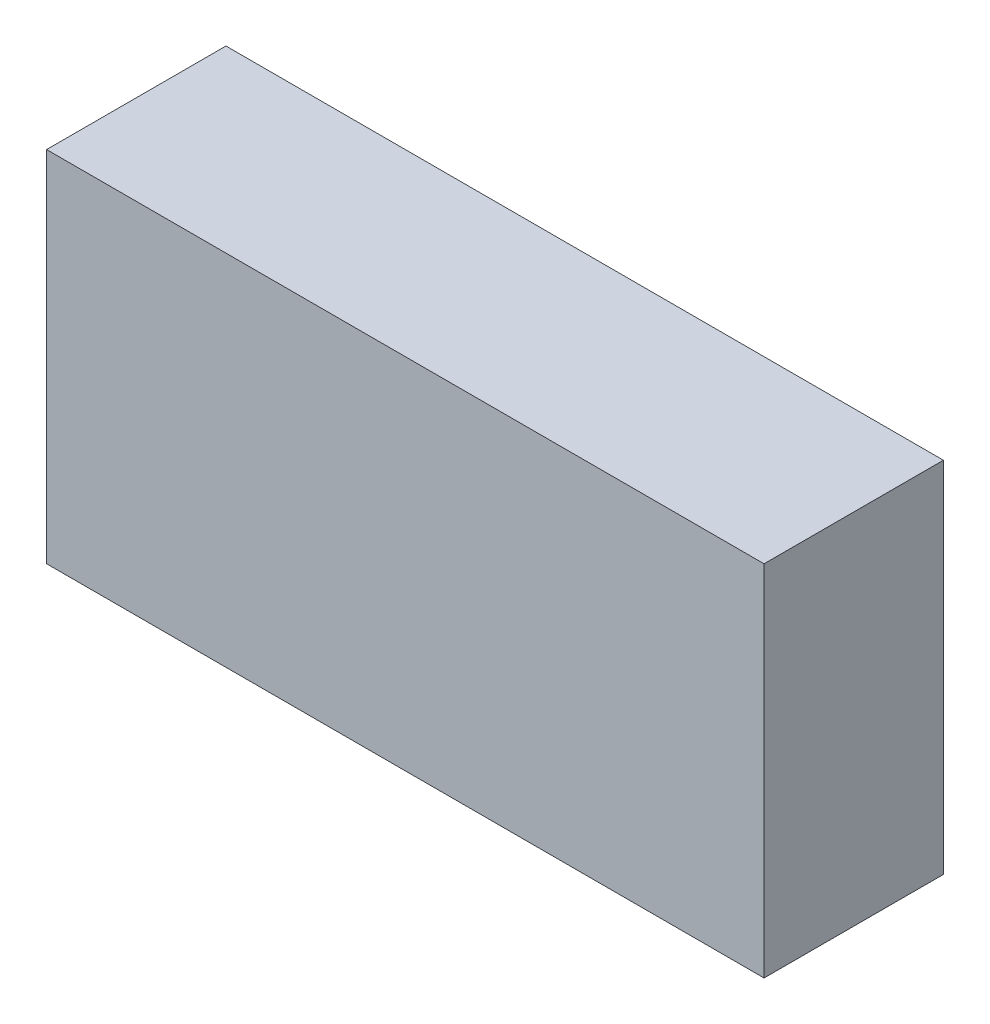
ISO-10303-21;
HEADER;
FILE_DESCRIPTION(('STEP AP214'),'2;1');
FILE_NAME('part.step','',(''),(''),'','','');
FILE_SCHEMA(('AUTOMOTIVE_DESIGN { 1 0 10303 214 1 1 1 1 }'));
ENDSEC;
DATA;
#1=APPLICATION_CONTEXT('core data for automotive mechanical design processes');
#2=APPLICATION_PROTOCOL_DEFINITION('international standard','automotive_design',2000,#1);
#3=PRODUCT_CONTEXT('',#1,'mechanical');
#4=PRODUCT('Part','Part','',(#3));
#5=PRODUCT_RELATED_PRODUCT_CATEGORY('part','',(#4));
#6=PRODUCT_DEFINITION_FORMATION('','',#4);
#7=PRODUCT_DEFINITION_CONTEXT('part definition',#1,'design');
#8=PRODUCT_DEFINITION('design','',#6,#7);
#9=PRODUCT_DEFINITION_SHAPE('','',#8);
#10=(LENGTH_UNIT() NAMED_UNIT(*) SI_UNIT(.MILLI.,.METRE.));
#11=(NAMED_UNIT(*) PLANE_ANGLE_UNIT() SI_UNIT($,.RADIAN.));
#12=(NAMED_UNIT(*) SI_UNIT($,.STERADIAN.) SOLID_ANGLE_UNIT());
#13=UNCERTAINTY_MEASURE_WITH_UNIT(LENGTH_MEASURE(1.E-05),#10,'distance_accuracy_value','');
#14=(GEOMETRIC_REPRESENTATION_CONTEXT(3) GLOBAL_UNCERTAINTY_ASSIGNED_CONTEXT((#13)) GLOBAL_UNIT_ASSIGNED_CONTEXT((#10,
#11,#12)) REPRESENTATION_CONTEXT('',''));
#15=CARTESIAN_POINT('',(0.,0.,0.));
#16=DIRECTION('',(0.,0.,1.));
#17=DIRECTION('',(1.,0.,0.));
#18=AXIS2_PLACEMENT_3D('',#15,#16,#17);
#19=CARTESIAN_POINT('',(0.,0.,35.));
#20=DIRECTION('',(1.,0.,0.));
#21=DIRECTION('',(0.,0.,-1.));
#22=AXIS2_PLACEMENT_3D('',#19,#20,#21);
#23=PLANE('',#22);
#24=DIRECTION('',(0.,-1.,0.));
#25=VECTOR('',#24,1.);
#26=CARTESIAN_POINT('',(0.,0.,0.));
#27=LINE('',#26,#25);
#28=CARTESIAN_POINT('',(0.,70.,0.));
#29=VERTEX_POINT('',#28);
#30=CARTESIAN_POINT('',(0.,0.,0.));
#31=VERTEX_POINT('',#30);
#32=EDGE_CURVE('E95',#29,#31,#27,.T.);
#33=ORIENTED_EDGE('',*,*,#32,.T.);
#34=DIRECTION('',(0.,0.,-1.));
#35=VECTOR('',#34,1.);
#36=CARTESIAN_POINT('',(0.,0.,35.));
#37=LINE('',#36,#35);
#38=CARTESIAN_POINT('',(0.,0.,35.));
#39=VERTEX_POINT('',#38);
#40=EDGE_CURVE('E11',#39,#31,#37,.T.);
#41=ORIENTED_EDGE('',*,*,#40,.F.);
#42=DIRECTION('',(0.,-1.,0.));
#43=VECTOR('',#42,1.);
#44=CARTESIAN_POINT('',(0.,0.,35.));
#45=LINE('',#44,#43);
#46=CARTESIAN_POINT('',(0.,70.,35.));
#47=VERTEX_POINT('',#46);
#48=EDGE_CURVE('E83',#47,#39,#45,.T.);
#49=ORIENTED_EDGE('',*,*,#48,.F.);
#50=DIRECTION('',(0.,0.,-1.));
#51=VECTOR('',#50,1.);
#52=CARTESIAN_POINT('',(0.,70.,35.));
#53=LINE('',#52,#51);
#54=EDGE_CURVE('E91',#47,#29,#53,.T.);
#55=ORIENTED_EDGE('',*,*,#54,.T.);
#56=EDGE_LOOP('',(#33,#41,#49,#55));
#57=FACE_BOUND('',#56,.T.);
#58=ADVANCED_FACE('F32',(#57),#23,.F.);
#59=CARTESIAN_POINT('',(0.,0.,35.));
#60=DIRECTION('',(0.,1.,0.));
#61=DIRECTION('',(0.,0.,1.));
#62=AXIS2_PLACEMENT_3D('',#59,#60,#61);
#63=PLANE('',#62);
#64=DIRECTION('',(1.,0.,0.));
#65=VECTOR('',#64,1.);
#66=CARTESIAN_POINT('',(0.,0.,0.));
#67=LINE('',#66,#65);
#68=CARTESIAN_POINT('',(140.,0.,0.));
#69=VERTEX_POINT('',#68);
#70=EDGE_CURVE('E87',#31,#69,#67,.T.);
#71=ORIENTED_EDGE('',*,*,#70,.T.);
#72=DIRECTION('',(0.,0.,-1.));
#73=VECTOR('',#72,1.);
#74=CARTESIAN_POINT('',(140.,0.,35.));
#75=LINE('',#74,#73);
#76=CARTESIAN_POINT('',(140.,0.,35.));
#77=VERTEX_POINT('',#76);
#78=EDGE_CURVE('E40',#77,#69,#75,.T.);
#79=ORIENTED_EDGE('',*,*,#78,.F.);
#80=DIRECTION('',(1.,0.,0.));
#81=VECTOR('',#80,1.);
#82=CARTESIAN_POINT('',(0.,0.,35.));
#83=LINE('',#82,#81);
#84=EDGE_CURVE('E78',#39,#77,#83,.T.);
#85=ORIENTED_EDGE('',*,*,#84,.F.);
#86=ORIENTED_EDGE('',*,*,#40,.T.);
#87=EDGE_LOOP('',(#71,#79,#85,#86));
#88=FACE_BOUND('',#87,.T.);
#89=ADVANCED_FACE('F86',(#88),#63,.F.);
#90=CARTESIAN_POINT('',(140.,0.,35.));
#91=DIRECTION('',(-1.,0.,0.));
#92=DIRECTION('',(0.,0.,1.));
#93=AXIS2_PLACEMENT_3D('',#90,#91,#92);
#94=PLANE('',#93);
#95=DIRECTION('',(0.,1.,0.));
#96=VECTOR('',#95,1.);
#97=CARTESIAN_POINT('',(140.,0.,0.));
#98=LINE('',#97,#96);
#99=CARTESIAN_POINT('',(140.,70.,0.));
#100=VERTEX_POINT('',#99);
#101=EDGE_CURVE('E65',#69,#100,#98,.T.);
#102=ORIENTED_EDGE('',*,*,#101,.T.);
#103=DIRECTION('',(0.,0.,-1.));
#104=VECTOR('',#103,1.);
#105=CARTESIAN_POINT('',(140.,70.,35.));
#106=LINE('',#105,#104);
#107=CARTESIAN_POINT('',(140.,70.,35.));
#108=VERTEX_POINT('',#107);
#109=EDGE_CURVE('E88',#108,#100,#106,.T.);
#110=ORIENTED_EDGE('',*,*,#109,.F.);
#111=DIRECTION('',(0.,1.,0.));
#112=VECTOR('',#111,1.);
#113=CARTESIAN_POINT('',(140.,0.,35.));
#114=LINE('',#113,#112);
#115=EDGE_CURVE('E81',#77,#108,#114,.T.);
#116=ORIENTED_EDGE('',*,*,#115,.F.);
#117=ORIENTED_EDGE('',*,*,#78,.T.);
#118=EDGE_LOOP('',(#102,#110,#116,#117));
#119=FACE_BOUND('',#118,.T.);
#120=ADVANCED_FACE('F89',(#119),#94,.F.);
#121=CARTESIAN_POINT('',(0.,70.,35.));
#122=DIRECTION('',(0.,-1.,0.));
#123=DIRECTION('',(0.,0.,-1.));
#124=AXIS2_PLACEMENT_3D('',#121,#122,#123);
#125=PLANE('',#124);
#126=DIRECTION('',(-1.,0.,0.));
#127=VECTOR('',#126,1.);
#128=CARTESIAN_POINT('',(0.,70.,0.));
#129=LINE('',#128,#127);
#130=EDGE_CURVE('E71',#100,#29,#129,.T.);
#131=ORIENTED_EDGE('',*,*,#130,.T.);
#132=ORIENTED_EDGE('',*,*,#54,.F.);
#133=DIRECTION('',(-1.,0.,0.));
#134=VECTOR('',#133,1.);
#135=CARTESIAN_POINT('',(0.,70.,35.));
#136=LINE('',#135,#134);
#137=EDGE_CURVE('E48',#108,#47,#136,.T.);
#138=ORIENTED_EDGE('',*,*,#137,.F.);
#139=ORIENTED_EDGE('',*,*,#109,.T.);
#140=EDGE_LOOP('',(#131,#132,#138,#139));
#141=FACE_BOUND('',#140,.T.);
#142=ADVANCED_FACE('F102',(#141),#125,.F.);
#143=CARTESIAN_POINT('',(0.,0.,35.));
#144=DIRECTION('',(0.,0.,-1.));
#145=DIRECTION('',(-1.,0.,0.));
#146=AXIS2_PLACEMENT_3D('',#143,#144,#145);
#147=PLANE('',#146);
#148=ORIENTED_EDGE('',*,*,#48,.T.);
#149=ORIENTED_EDGE('',*,*,#84,.T.);
#150=ORIENTED_EDGE('',*,*,#115,.T.);
#151=ORIENTED_EDGE('',*,*,#137,.T.);
#152=EDGE_LOOP('',(#148,#149,#150,#151));
#153=FACE_BOUND('',#152,.T.);
#154=ADVANCED_FACE('F79',(#153),#147,.F.);
#155=CARTESIAN_POINT('',(0.,0.,0.));
#156=DIRECTION('',(0.,0.,-1.));
#157=DIRECTION('',(-1.,0.,0.));
#158=AXIS2_PLACEMENT_3D('',#155,#156,#157);
#159=PLANE('',#158);
#160=ORIENTED_EDGE('',*,*,#32,.F.);
#161=ORIENTED_EDGE('',*,*,#130,.F.);
#162=ORIENTED_EDGE('',*,*,#101,.F.);
#163=ORIENTED_EDGE('',*,*,#70,.F.);
#164=EDGE_LOOP('',(#160,#161,#162,#163));
#165=FACE_BOUND('',#164,.T.);
#166=ADVANCED_FACE('F105',(#165),#159,.T.);
#167=CLOSED_SHELL('',(#58,#89,#120,#142,#154,#166));
#168=MANIFOLD_SOLID_BREP('B2',#167);
#169=ADVANCED_BREP_SHAPE_REPRESENTATION('',(#18,#168),#14);
#170=SHAPE_DEFINITION_REPRESENTATION(#9,#169);
ENDSEC;
END-ISO-10303-21;
